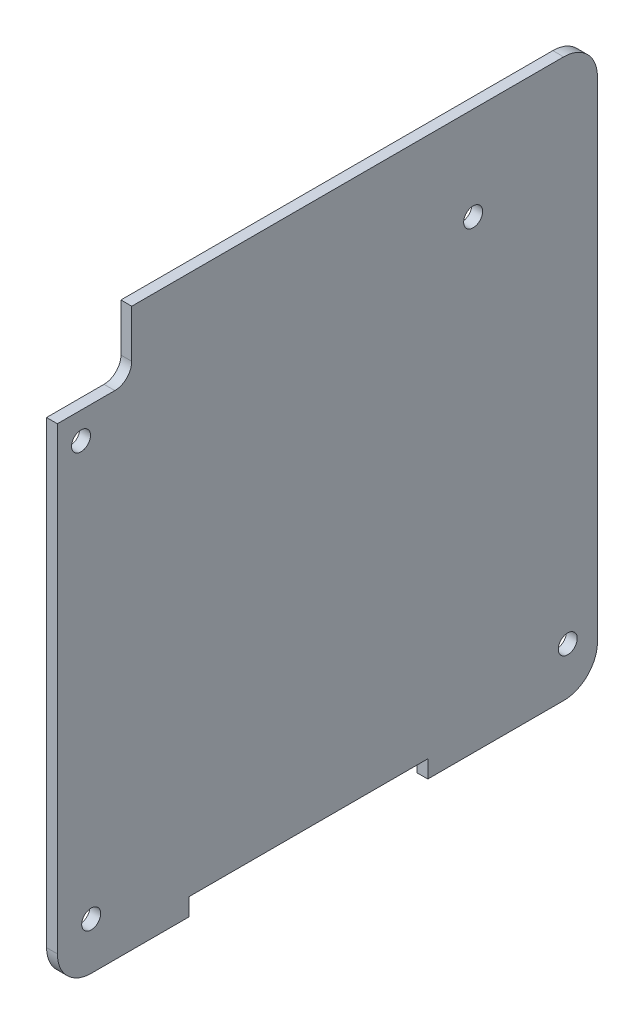
ISO-10303-21;
HEADER;
FILE_DESCRIPTION(('STEP AP214'),'2;1');
FILE_NAME('part.step','',(''),(''),'','','');
FILE_SCHEMA(('AUTOMOTIVE_DESIGN { 1 0 10303 214 1 1 1 1 }'));
ENDSEC;
DATA;
#1=APPLICATION_CONTEXT('core data for automotive mechanical design processes');
#2=APPLICATION_PROTOCOL_DEFINITION('international standard','automotive_design',2000,#1);
#3=PRODUCT_CONTEXT('',#1,'mechanical');
#4=PRODUCT('Part','Part','',(#3));
#5=PRODUCT_RELATED_PRODUCT_CATEGORY('part','',(#4));
#6=PRODUCT_DEFINITION_FORMATION('','',#4);
#7=PRODUCT_DEFINITION_CONTEXT('part definition',#1,'design');
#8=PRODUCT_DEFINITION('design','',#6,#7);
#9=PRODUCT_DEFINITION_SHAPE('','',#8);
#10=(LENGTH_UNIT() NAMED_UNIT(*) SI_UNIT(.MILLI.,.METRE.));
#11=(NAMED_UNIT(*) PLANE_ANGLE_UNIT() SI_UNIT($,.RADIAN.));
#12=(NAMED_UNIT(*) SI_UNIT($,.STERADIAN.) SOLID_ANGLE_UNIT());
#13=UNCERTAINTY_MEASURE_WITH_UNIT(LENGTH_MEASURE(1.E-05),#10,'distance_accuracy_value','');
#14=(GEOMETRIC_REPRESENTATION_CONTEXT(3) GLOBAL_UNCERTAINTY_ASSIGNED_CONTEXT((#13)) GLOBAL_UNIT_ASSIGNED_CONTEXT((#10,
#11,#12)) REPRESENTATION_CONTEXT('',''));
#15=CARTESIAN_POINT('',(0.,0.,0.));
#16=DIRECTION('',(0.,0.,1.));
#17=DIRECTION('',(1.,0.,0.));
#18=AXIS2_PLACEMENT_3D('',#15,#16,#17);
#19=CARTESIAN_POINT('',(0.8,33.7284132652433,31.7974349336434));
#20=DIRECTION('',(1.,0.,0.));
#21=DIRECTION('',(0.,0.,-1.));
#22=AXIS2_PLACEMENT_3D('',#19,#20,#21);
#23=PLANE('',#22);
#24=CARTESIAN_POINT('',(0.8,-34.7152301778722,35.2974349336434));
#25=DIRECTION('',(1.,0.,0.));
#26=DIRECTION('',(0.,0.,-1.));
#27=AXIS2_PLACEMENT_3D('',#24,#25,#26);
#28=CIRCLE('',#27,1.4);
#29=CARTESIAN_POINT('',(0.8,-34.7152301778722,33.8974349336434));
#30=VERTEX_POINT('',#29);
#31=EDGE_CURVE('E368',#30,#30,#28,.T.);
#32=ORIENTED_EDGE('',*,*,#31,.F.);
#33=EDGE_LOOP('',(#32));
#34=FACE_BOUND('',#33,.T.);
#35=CARTESIAN_POINT('',(0.8,27.2847698221278,36.7974349336434));
#36=DIRECTION('',(1.,0.,0.));
#37=DIRECTION('',(0.,0.,-1.));
#38=AXIS2_PLACEMENT_3D('',#35,#36,#37);
#39=CIRCLE('',#38,1.4);
#40=CARTESIAN_POINT('',(0.8,27.2847698221278,35.3974349336434));
#41=VERTEX_POINT('',#40);
#42=EDGE_CURVE('E186',#41,#41,#39,.T.);
#43=ORIENTED_EDGE('',*,*,#42,.F.);
#44=EDGE_LOOP('',(#43));
#45=FACE_BOUND('',#44,.T.);
#46=CARTESIAN_POINT('',(0.8,33.7284132652433,31.7974349336434));
#47=DIRECTION('',(-1.,0.,0.));
#48=DIRECTION('',(0.,0.,-1.));
#49=AXIS2_PLACEMENT_3D('',#46,#47,#48);
#50=CIRCLE('',#49,2.5);
#51=CARTESIAN_POINT('',(0.8,33.7284132652433,29.2974349336434));
#52=VERTEX_POINT('',#51);
#53=CARTESIAN_POINT('',(0.8,31.2284132652433,31.7974349336434));
#54=VERTEX_POINT('',#53);
#55=EDGE_CURVE('E222',#52,#54,#50,.T.);
#56=ORIENTED_EDGE('',*,*,#55,.T.);
#57=DIRECTION('',(0.,0.,1.));
#58=VECTOR('',#57,1.);
#59=CARTESIAN_POINT('',(0.8,31.2284132652433,40.2974349336434));
#60=LINE('',#59,#58);
#61=CARTESIAN_POINT('',(0.8,31.2284132652433,40.2974349336434));
#62=VERTEX_POINT('',#61);
#63=EDGE_CURVE('E122',#54,#62,#60,.T.);
#64=ORIENTED_EDGE('',*,*,#63,.T.);
#65=DIRECTION('',(0.,-1.,0.));
#66=VECTOR('',#65,1.);
#67=CARTESIAN_POINT('',(0.8,-36.688152999817,40.2974349336434));
#68=LINE('',#67,#66);
#69=CARTESIAN_POINT('',(0.8,-36.688152999817,40.2974349336434));
#70=VERTEX_POINT('',#69);
#71=EDGE_CURVE('E267',#62,#70,#68,.T.);
#72=ORIENTED_EDGE('',*,*,#71,.T.);
#73=CARTESIAN_POINT('',(0.8,-36.688152999817,35.2974349336434));
#74=DIRECTION('',(1.,0.,0.));
#75=DIRECTION('',(0.,0.,1.));
#76=AXIS2_PLACEMENT_3D('',#73,#74,#75);
#77=CIRCLE('',#76,5.);
#78=CARTESIAN_POINT('',(0.8,-41.688152999817,35.2974349336434));
#79=VERTEX_POINT('',#78);
#80=EDGE_CURVE('E287',#70,#79,#77,.T.);
#81=ORIENTED_EDGE('',*,*,#80,.T.);
#82=DIRECTION('',(0.,0.,-1.));
#83=VECTOR('',#82,1.);
#84=CARTESIAN_POINT('',(0.8,-41.688152999817,35.2974349336434));
#85=LINE('',#84,#83);
#86=CARTESIAN_POINT('',(0.8,-41.688152999817,20.8094349336434));
#87=VERTEX_POINT('',#86);
#88=EDGE_CURVE('E283',#79,#87,#85,.T.);
#89=ORIENTED_EDGE('',*,*,#88,.T.);
#90=DIRECTION('',(0.,1.,0.));
#91=VECTOR('',#90,1.);
#92=CARTESIAN_POINT('',(0.8,-41.688152999817,20.8094349336434));
#93=LINE('',#92,#91);
#94=CARTESIAN_POINT('',(0.8,-39.097052999817,20.8094349336434));
#95=VERTEX_POINT('',#94);
#96=EDGE_CURVE('E286',#87,#95,#93,.T.);
#97=ORIENTED_EDGE('',*,*,#96,.T.);
#98=DIRECTION('',(0.,0.,-1.));
#99=VECTOR('',#98,1.);
#100=CARTESIAN_POINT('',(0.8,-39.097052999817,20.8094349336434));
#101=LINE('',#100,#99);
#102=CARTESIAN_POINT('',(0.8,-39.097052999817,-14.4965650663566));
#103=VERTEX_POINT('',#102);
#104=EDGE_CURVE('E291',#95,#103,#101,.T.);
#105=ORIENTED_EDGE('',*,*,#104,.T.);
#106=DIRECTION('',(0.,-1.,0.));
#107=VECTOR('',#106,1.);
#108=CARTESIAN_POINT('',(0.8,-39.097052999817,-14.4965650663566));
#109=LINE('',#108,#107);
#110=CARTESIAN_POINT('',(0.8,-41.688152999817,-14.4965650663566));
#111=VERTEX_POINT('',#110);
#112=EDGE_CURVE('E298',#103,#111,#109,.T.);
#113=ORIENTED_EDGE('',*,*,#112,.T.);
#114=DIRECTION('',(0.,0.,-1.));
#115=VECTOR('',#114,1.);
#116=CARTESIAN_POINT('',(0.8,-41.688152999817,-14.4965650663566));
#117=LINE('',#116,#115);
#118=CARTESIAN_POINT('',(0.8,-41.688152999817,-34.592039339058));
#119=VERTEX_POINT('',#118);
#120=EDGE_CURVE('E301',#111,#119,#117,.T.);
#121=ORIENTED_EDGE('',*,*,#120,.T.);
#122=CARTESIAN_POINT('',(0.8,-36.688152999817,-34.592039339058));
#123=DIRECTION('',(1.,0.,0.));
#124=DIRECTION('',(0.,0.,-1.));
#125=AXIS2_PLACEMENT_3D('',#122,#123,#124);
#126=CIRCLE('',#125,5.);
#127=CARTESIAN_POINT('',(0.8,-36.688152999817,-39.592039339058));
#128=VERTEX_POINT('',#127);
#129=EDGE_CURVE('E304',#119,#128,#126,.T.);
#130=ORIENTED_EDGE('',*,*,#129,.T.);
#131=DIRECTION('',(0.,1.,0.));
#132=VECTOR('',#131,1.);
#133=CARTESIAN_POINT('',(0.8,-36.688152999817,-39.592039339058));
#134=LINE('',#133,#132);
#135=CARTESIAN_POINT('',(0.8,35.7847698221278,-39.592039339058));
#136=VERTEX_POINT('',#135);
#137=EDGE_CURVE('E159',#128,#136,#134,.T.);
#138=ORIENTED_EDGE('',*,*,#137,.T.);
#139=CARTESIAN_POINT('',(0.8,35.7847698221278,-34.592039339058));
#140=DIRECTION('',(1.,0.,0.));
#141=DIRECTION('',(0.,0.,1.));
#142=AXIS2_PLACEMENT_3D('',#139,#140,#141);
#143=CIRCLE('',#142,5.00000000000001);
#144=CARTESIAN_POINT('',(0.8,40.7847698221278,-34.592039339058));
#145=VERTEX_POINT('',#144);
#146=EDGE_CURVE('E153',#136,#145,#143,.T.);
#147=ORIENTED_EDGE('',*,*,#146,.T.);
#148=DIRECTION('',(0.,0.,1.));
#149=VECTOR('',#148,1.);
#150=CARTESIAN_POINT('',(0.8,40.7847698221278,29.2974349336434));
#151=LINE('',#150,#149);
#152=CARTESIAN_POINT('',(0.8,40.7847698221278,29.2974349336434));
#153=VERTEX_POINT('',#152);
#154=EDGE_CURVE('E157',#145,#153,#151,.T.);
#155=ORIENTED_EDGE('',*,*,#154,.T.);
#156=DIRECTION('',(0.,-1.,0.));
#157=VECTOR('',#156,1.);
#158=CARTESIAN_POINT('',(0.8,40.7847698221278,29.2974349336434));
#159=LINE('',#158,#157);
#160=EDGE_CURVE('E61',#153,#52,#159,.T.);
#161=ORIENTED_EDGE('',*,*,#160,.T.);
#162=EDGE_LOOP('',(#56,#64,#72,#81,#89,#97,#105,#113,#121,#130,#138,#147,#155,#161));
#163=FACE_BOUND('',#162,.T.);
#164=CARTESIAN_POINT('',(0.8,26.9847698221278,-21.2025650663566));
#165=DIRECTION('',(1.,0.,0.));
#166=DIRECTION('',(0.,0.,-1.));
#167=AXIS2_PLACEMENT_3D('',#164,#165,#166);
#168=CIRCLE('',#167,1.4);
#169=CARTESIAN_POINT('',(0.8,26.9847698221278,-22.6025650663566));
#170=VERTEX_POINT('',#169);
#171=EDGE_CURVE('E376',#170,#170,#168,.T.);
#172=ORIENTED_EDGE('',*,*,#171,.F.);
#173=EDGE_LOOP('',(#172));
#174=FACE_BOUND('',#173,.T.);
#175=CARTESIAN_POINT('',(0.8,-34.7152301778722,-35.2025650663566));
#176=DIRECTION('',(1.,0.,0.));
#177=DIRECTION('',(0.,0.,-1.));
#178=AXIS2_PLACEMENT_3D('',#175,#176,#177);
#179=CIRCLE('',#178,1.4);
#180=CARTESIAN_POINT('',(0.8,-34.7152301778722,-36.6025650663566));
#181=VERTEX_POINT('',#180);
#182=EDGE_CURVE('E357',#181,#181,#179,.T.);
#183=ORIENTED_EDGE('',*,*,#182,.F.);
#184=EDGE_LOOP('',(#183));
#185=FACE_BOUND('',#184,.T.);
#186=ADVANCED_FACE('F43',(#34,#45,#163,#174,#185),#23,.T.);
#187=CARTESIAN_POINT('',(-0.8,33.7284132652433,31.7974349336434));
#188=DIRECTION('',(1.,0.,0.));
#189=DIRECTION('',(0.,0.,-1.));
#190=AXIS2_PLACEMENT_3D('',#187,#188,#189);
#191=PLANE('',#190);
#192=CARTESIAN_POINT('',(-0.8,33.7284132652433,31.7974349336434));
#193=DIRECTION('',(-1.,0.,0.));
#194=DIRECTION('',(0.,0.,-1.));
#195=AXIS2_PLACEMENT_3D('',#192,#193,#194);
#196=CIRCLE('',#195,2.5);
#197=CARTESIAN_POINT('',(-0.8,33.7284132652433,29.2974349336434));
#198=VERTEX_POINT('',#197);
#199=CARTESIAN_POINT('',(-0.8,31.2284132652433,31.7974349336434));
#200=VERTEX_POINT('',#199);
#201=EDGE_CURVE('E181',#198,#200,#196,.T.);
#202=ORIENTED_EDGE('',*,*,#201,.F.);
#203=DIRECTION('',(0.,-1.,0.));
#204=VECTOR('',#203,1.);
#205=CARTESIAN_POINT('',(-0.8,40.7847698221278,29.2974349336434));
#206=LINE('',#205,#204);
#207=CARTESIAN_POINT('',(-0.8,40.7847698221278,29.2974349336434));
#208=VERTEX_POINT('',#207);
#209=EDGE_CURVE('E114',#208,#198,#206,.T.);
#210=ORIENTED_EDGE('',*,*,#209,.F.);
#211=DIRECTION('',(0.,0.,1.));
#212=VECTOR('',#211,1.);
#213=CARTESIAN_POINT('',(-0.8,40.7847698221278,29.2974349336434));
#214=LINE('',#213,#212);
#215=CARTESIAN_POINT('',(-0.8,40.7847698221278,-34.592039339058));
#216=VERTEX_POINT('',#215);
#217=EDGE_CURVE('E108',#216,#208,#214,.T.);
#218=ORIENTED_EDGE('',*,*,#217,.F.);
#219=CARTESIAN_POINT('',(-0.8,35.7847698221278,-34.592039339058));
#220=DIRECTION('',(1.,0.,0.));
#221=DIRECTION('',(0.,0.,1.));
#222=AXIS2_PLACEMENT_3D('',#219,#220,#221);
#223=CIRCLE('',#222,5.00000000000001);
#224=CARTESIAN_POINT('',(-0.8,35.7847698221278,-39.592039339058));
#225=VERTEX_POINT('',#224);
#226=EDGE_CURVE('E168',#225,#216,#223,.T.);
#227=ORIENTED_EDGE('',*,*,#226,.F.);
#228=DIRECTION('',(0.,1.,0.));
#229=VECTOR('',#228,1.);
#230=CARTESIAN_POINT('',(-0.8,-36.688152999817,-39.592039339058));
#231=LINE('',#230,#229);
#232=CARTESIAN_POINT('',(-0.8,-36.688152999817,-39.592039339058));
#233=VERTEX_POINT('',#232);
#234=EDGE_CURVE('E213',#233,#225,#231,.T.);
#235=ORIENTED_EDGE('',*,*,#234,.F.);
#236=CARTESIAN_POINT('',(-0.8,-36.688152999817,-34.592039339058));
#237=DIRECTION('',(1.,0.,0.));
#238=DIRECTION('',(0.,0.,-1.));
#239=AXIS2_PLACEMENT_3D('',#236,#237,#238);
#240=CIRCLE('',#239,5.);
#241=CARTESIAN_POINT('',(-0.8,-41.688152999817,-34.592039339058));
#242=VERTEX_POINT('',#241);
#243=EDGE_CURVE('E210',#242,#233,#240,.T.);
#244=ORIENTED_EDGE('',*,*,#243,.F.);
#245=DIRECTION('',(0.,0.,-1.));
#246=VECTOR('',#245,1.);
#247=CARTESIAN_POINT('',(-0.8,-41.688152999817,-14.4965650663566));
#248=LINE('',#247,#246);
#249=CARTESIAN_POINT('',(-0.8,-41.688152999817,-14.4965650663566));
#250=VERTEX_POINT('',#249);
#251=EDGE_CURVE('E207',#250,#242,#248,.T.);
#252=ORIENTED_EDGE('',*,*,#251,.F.);
#253=DIRECTION('',(0.,-1.,0.));
#254=VECTOR('',#253,1.);
#255=CARTESIAN_POINT('',(-0.8,-39.097052999817,-14.4965650663566));
#256=LINE('',#255,#254);
#257=CARTESIAN_POINT('',(-0.8,-39.097052999817,-14.4965650663566));
#258=VERTEX_POINT('',#257);
#259=EDGE_CURVE('E204',#258,#250,#256,.T.);
#260=ORIENTED_EDGE('',*,*,#259,.F.);
#261=DIRECTION('',(0.,0.,-1.));
#262=VECTOR('',#261,1.);
#263=CARTESIAN_POINT('',(-0.8,-39.097052999817,20.8094349336434));
#264=LINE('',#263,#262);
#265=CARTESIAN_POINT('',(-0.8,-39.097052999817,20.8094349336434));
#266=VERTEX_POINT('',#265);
#267=EDGE_CURVE('E201',#266,#258,#264,.T.);
#268=ORIENTED_EDGE('',*,*,#267,.F.);
#269=DIRECTION('',(0.,1.,0.));
#270=VECTOR('',#269,1.);
#271=CARTESIAN_POINT('',(-0.8,-41.688152999817,20.8094349336434));
#272=LINE('',#271,#270);
#273=CARTESIAN_POINT('',(-0.8,-41.688152999817,20.8094349336434));
#274=VERTEX_POINT('',#273);
#275=EDGE_CURVE('E198',#274,#266,#272,.T.);
#276=ORIENTED_EDGE('',*,*,#275,.F.);
#277=DIRECTION('',(0.,0.,-1.));
#278=VECTOR('',#277,1.);
#279=CARTESIAN_POINT('',(-0.8,-41.688152999817,35.2974349336434));
#280=LINE('',#279,#278);
#281=CARTESIAN_POINT('',(-0.8,-41.688152999817,35.2974349336434));
#282=VERTEX_POINT('',#281);
#283=EDGE_CURVE('E195',#282,#274,#280,.T.);
#284=ORIENTED_EDGE('',*,*,#283,.F.);
#285=CARTESIAN_POINT('',(-0.8,-36.688152999817,35.2974349336434));
#286=DIRECTION('',(1.,0.,0.));
#287=DIRECTION('',(0.,0.,1.));
#288=AXIS2_PLACEMENT_3D('',#285,#286,#287);
#289=CIRCLE('',#288,5.);
#290=CARTESIAN_POINT('',(-0.8,-36.688152999817,40.2974349336434));
#291=VERTEX_POINT('',#290);
#292=EDGE_CURVE('E192',#291,#282,#289,.T.);
#293=ORIENTED_EDGE('',*,*,#292,.F.);
#294=DIRECTION('',(0.,-1.,0.));
#295=VECTOR('',#294,1.);
#296=CARTESIAN_POINT('',(-0.8,-36.688152999817,40.2974349336434));
#297=LINE('',#296,#295);
#298=CARTESIAN_POINT('',(-0.8,31.2284132652433,40.2974349336434));
#299=VERTEX_POINT('',#298);
#300=EDGE_CURVE('E189',#299,#291,#297,.T.);
#301=ORIENTED_EDGE('',*,*,#300,.F.);
#302=DIRECTION('',(0.,0.,1.));
#303=VECTOR('',#302,1.);
#304=CARTESIAN_POINT('',(-0.8,31.2284132652433,40.2974349336434));
#305=LINE('',#304,#303);
#306=EDGE_CURVE('E185',#200,#299,#305,.T.);
#307=ORIENTED_EDGE('',*,*,#306,.F.);
#308=EDGE_LOOP('',(#202,#210,#218,#227,#235,#244,#252,#260,#268,#276,#284,#293,#301,#307));
#309=FACE_BOUND('',#308,.T.);
#310=CARTESIAN_POINT('',(-0.8,27.2847698221278,36.7974349336434));
#311=DIRECTION('',(1.,0.,0.));
#312=DIRECTION('',(0.,0.,-1.));
#313=AXIS2_PLACEMENT_3D('',#310,#311,#312);
#314=CIRCLE('',#313,1.4);
#315=CARTESIAN_POINT('',(-0.8,27.2847698221278,35.3974349336434));
#316=VERTEX_POINT('',#315);
#317=EDGE_CURVE('E380',#316,#316,#314,.T.);
#318=ORIENTED_EDGE('',*,*,#317,.T.);
#319=EDGE_LOOP('',(#318));
#320=FACE_BOUND('',#319,.T.);
#321=CARTESIAN_POINT('',(-0.8,26.9847698221278,-21.2025650663566));
#322=DIRECTION('',(1.,0.,0.));
#323=DIRECTION('',(0.,0.,-1.));
#324=AXIS2_PLACEMENT_3D('',#321,#322,#323);
#325=CIRCLE('',#324,1.4);
#326=CARTESIAN_POINT('',(-0.8,26.9847698221278,-22.6025650663566));
#327=VERTEX_POINT('',#326);
#328=EDGE_CURVE('E372',#327,#327,#325,.T.);
#329=ORIENTED_EDGE('',*,*,#328,.T.);
#330=EDGE_LOOP('',(#329));
#331=FACE_BOUND('',#330,.T.);
#332=CARTESIAN_POINT('',(-0.8,-34.7152301778722,35.2974349336434));
#333=DIRECTION('',(1.,0.,0.));
#334=DIRECTION('',(0.,0.,-1.));
#335=AXIS2_PLACEMENT_3D('',#332,#333,#334);
#336=CIRCLE('',#335,1.4);
#337=CARTESIAN_POINT('',(-0.8,-34.7152301778722,33.8974349336434));
#338=VERTEX_POINT('',#337);
#339=EDGE_CURVE('E365',#338,#338,#336,.T.);
#340=ORIENTED_EDGE('',*,*,#339,.T.);
#341=EDGE_LOOP('',(#340));
#342=FACE_BOUND('',#341,.T.);
#343=CARTESIAN_POINT('',(-0.8,-34.7152301778722,-35.2025650663566));
#344=DIRECTION('',(1.,0.,0.));
#345=DIRECTION('',(0.,0.,-1.));
#346=AXIS2_PLACEMENT_3D('',#343,#344,#345);
#347=CIRCLE('',#346,1.4);
#348=CARTESIAN_POINT('',(-0.8,-34.7152301778722,-36.6025650663566));
#349=VERTEX_POINT('',#348);
#350=EDGE_CURVE('E360',#349,#349,#347,.T.);
#351=ORIENTED_EDGE('',*,*,#350,.T.);
#352=EDGE_LOOP('',(#351));
#353=FACE_BOUND('',#352,.T.);
#354=ADVANCED_FACE('F271',(#309,#320,#331,#342,#353),#191,.F.);
#355=CARTESIAN_POINT('',(0.8,33.7284132652433,31.7974349336434));
#356=DIRECTION('',(-1.,0.,0.));
#357=DIRECTION('',(0.,0.,1.));
#358=AXIS2_PLACEMENT_3D('',#355,#356,#357);
#359=CYLINDRICAL_SURFACE('',#358,2.5);
#360=ORIENTED_EDGE('',*,*,#201,.T.);
#361=DIRECTION('',(-1.,0.,0.));
#362=VECTOR('',#361,1.);
#363=CARTESIAN_POINT('',(0.8,31.2284132652433,31.7974349336434));
#364=LINE('',#363,#362);
#365=EDGE_CURVE('E11',#54,#200,#364,.T.);
#366=ORIENTED_EDGE('',*,*,#365,.F.);
#367=ORIENTED_EDGE('',*,*,#55,.F.);
#368=DIRECTION('',(-1.,0.,0.));
#369=VECTOR('',#368,1.);
#370=CARTESIAN_POINT('',(0.8,33.7284132652433,29.2974349336434));
#371=LINE('',#370,#369);
#372=EDGE_CURVE('E177',#52,#198,#371,.T.);
#373=ORIENTED_EDGE('',*,*,#372,.T.);
#374=EDGE_LOOP('',(#360,#366,#367,#373));
#375=FACE_BOUND('',#374,.T.);
#376=ADVANCED_FACE('F45',(#375),#359,.F.);
#377=CARTESIAN_POINT('',(0.8,31.2284132652433,40.2974349336434));
#378=DIRECTION('',(0.,-1.,0.));
#379=DIRECTION('',(0.,0.,-1.));
#380=AXIS2_PLACEMENT_3D('',#377,#378,#379);
#381=PLANE('',#380);
#382=ORIENTED_EDGE('',*,*,#306,.T.);
#383=DIRECTION('',(-1.,0.,0.));
#384=VECTOR('',#383,1.);
#385=CARTESIAN_POINT('',(0.8,31.2284132652433,40.2974349336434));
#386=LINE('',#385,#384);
#387=EDGE_CURVE('E53',#62,#299,#386,.T.);
#388=ORIENTED_EDGE('',*,*,#387,.F.);
#389=ORIENTED_EDGE('',*,*,#63,.F.);
#390=ORIENTED_EDGE('',*,*,#365,.T.);
#391=EDGE_LOOP('',(#382,#388,#389,#390));
#392=FACE_BOUND('',#391,.T.);
#393=ADVANCED_FACE('F528',(#392),#381,.F.);
#394=CARTESIAN_POINT('',(0.8,-36.688152999817,40.2974349336434));
#395=DIRECTION('',(0.,0.,-1.));
#396=DIRECTION('',(-1.,0.,0.));
#397=AXIS2_PLACEMENT_3D('',#394,#395,#396);
#398=PLANE('',#397);
#399=ORIENTED_EDGE('',*,*,#300,.T.);
#400=DIRECTION('',(-1.,0.,0.));
#401=VECTOR('',#400,1.);
#402=CARTESIAN_POINT('',(0.8,-36.688152999817,40.2974349336434));
#403=LINE('',#402,#401);
#404=EDGE_CURVE('E257',#70,#291,#403,.T.);
#405=ORIENTED_EDGE('',*,*,#404,.F.);
#406=ORIENTED_EDGE('',*,*,#71,.F.);
#407=ORIENTED_EDGE('',*,*,#387,.T.);
#408=EDGE_LOOP('',(#399,#405,#406,#407));
#409=FACE_BOUND('',#408,.T.);
#410=ADVANCED_FACE('F265',(#409),#398,.F.);
#411=CARTESIAN_POINT('',(0.8,-36.688152999817,35.2974349336434));
#412=DIRECTION('',(-1.,0.,0.));
#413=DIRECTION('',(0.,0.,1.));
#414=AXIS2_PLACEMENT_3D('',#411,#412,#413);
#415=CYLINDRICAL_SURFACE('',#414,5.);
#416=ORIENTED_EDGE('',*,*,#292,.T.);
#417=DIRECTION('',(-1.,0.,0.));
#418=VECTOR('',#417,1.);
#419=CARTESIAN_POINT('',(0.8,-41.688152999817,35.2974349336434));
#420=LINE('',#419,#418);
#421=EDGE_CURVE('E253',#79,#282,#420,.T.);
#422=ORIENTED_EDGE('',*,*,#421,.F.);
#423=ORIENTED_EDGE('',*,*,#80,.F.);
#424=ORIENTED_EDGE('',*,*,#404,.T.);
#425=EDGE_LOOP('',(#416,#422,#423,#424));
#426=FACE_BOUND('',#425,.T.);
#427=ADVANCED_FACE('F277',(#426),#415,.T.);
#428=CARTESIAN_POINT('',(0.8,-41.688152999817,35.2974349336434));
#429=DIRECTION('',(0.,1.,0.));
#430=DIRECTION('',(0.,0.,1.));
#431=AXIS2_PLACEMENT_3D('',#428,#429,#430);
#432=PLANE('',#431);
#433=ORIENTED_EDGE('',*,*,#283,.T.);
#434=DIRECTION('',(-1.,0.,0.));
#435=VECTOR('',#434,1.);
#436=CARTESIAN_POINT('',(0.8,-41.688152999817,20.8094349336434));
#437=LINE('',#436,#435);
#438=EDGE_CURVE('E249',#87,#274,#437,.T.);
#439=ORIENTED_EDGE('',*,*,#438,.F.);
#440=ORIENTED_EDGE('',*,*,#88,.F.);
#441=ORIENTED_EDGE('',*,*,#421,.T.);
#442=EDGE_LOOP('',(#433,#439,#440,#441));
#443=FACE_BOUND('',#442,.T.);
#444=ADVANCED_FACE('F281',(#443),#432,.F.);
#445=CARTESIAN_POINT('',(0.8,-41.688152999817,20.8094349336434));
#446=DIRECTION('',(0.,0.,1.));
#447=DIRECTION('',(1.,0.,0.));
#448=AXIS2_PLACEMENT_3D('',#445,#446,#447);
#449=PLANE('',#448);
#450=ORIENTED_EDGE('',*,*,#275,.T.);
#451=DIRECTION('',(-1.,0.,0.));
#452=VECTOR('',#451,1.);
#453=CARTESIAN_POINT('',(0.8,-39.097052999817,20.8094349336434));
#454=LINE('',#453,#452);
#455=EDGE_CURVE('E245',#95,#266,#454,.T.);
#456=ORIENTED_EDGE('',*,*,#455,.F.);
#457=ORIENTED_EDGE('',*,*,#96,.F.);
#458=ORIENTED_EDGE('',*,*,#438,.T.);
#459=EDGE_LOOP('',(#450,#456,#457,#458));
#460=FACE_BOUND('',#459,.T.);
#461=ADVANCED_FACE('F489',(#460),#449,.F.);
#462=CARTESIAN_POINT('',(0.8,-39.097052999817,20.8094349336434));
#463=DIRECTION('',(0.,1.,0.));
#464=DIRECTION('',(0.,0.,1.));
#465=AXIS2_PLACEMENT_3D('',#462,#463,#464);
#466=PLANE('',#465);
#467=ORIENTED_EDGE('',*,*,#267,.T.);
#468=DIRECTION('',(-1.,0.,0.));
#469=VECTOR('',#468,1.);
#470=CARTESIAN_POINT('',(0.8,-39.097052999817,-14.4965650663566));
#471=LINE('',#470,#469);
#472=EDGE_CURVE('E241',#103,#258,#471,.T.);
#473=ORIENTED_EDGE('',*,*,#472,.F.);
#474=ORIENTED_EDGE('',*,*,#104,.F.);
#475=ORIENTED_EDGE('',*,*,#455,.T.);
#476=EDGE_LOOP('',(#467,#473,#474,#475));
#477=FACE_BOUND('',#476,.T.);
#478=ADVANCED_FACE('F478',(#477),#466,.F.);
#479=CARTESIAN_POINT('',(0.8,-39.097052999817,-14.4965650663566));
#480=DIRECTION('',(0.,0.,-1.));
#481=DIRECTION('',(-1.,0.,0.));
#482=AXIS2_PLACEMENT_3D('',#479,#480,#481);
#483=PLANE('',#482);
#484=ORIENTED_EDGE('',*,*,#259,.T.);
#485=DIRECTION('',(-1.,0.,0.));
#486=VECTOR('',#485,1.);
#487=CARTESIAN_POINT('',(0.8,-41.688152999817,-14.4965650663566));
#488=LINE('',#487,#486);
#489=EDGE_CURVE('E237',#111,#250,#488,.T.);
#490=ORIENTED_EDGE('',*,*,#489,.F.);
#491=ORIENTED_EDGE('',*,*,#112,.F.);
#492=ORIENTED_EDGE('',*,*,#472,.T.);
#493=EDGE_LOOP('',(#484,#490,#491,#492));
#494=FACE_BOUND('',#493,.T.);
#495=ADVANCED_FACE('F467',(#494),#483,.F.);
#496=CARTESIAN_POINT('',(0.8,-41.688152999817,-14.4965650663566));
#497=DIRECTION('',(0.,1.,0.));
#498=DIRECTION('',(0.,0.,1.));
#499=AXIS2_PLACEMENT_3D('',#496,#497,#498);
#500=PLANE('',#499);
#501=ORIENTED_EDGE('',*,*,#251,.T.);
#502=DIRECTION('',(-1.,0.,0.));
#503=VECTOR('',#502,1.);
#504=CARTESIAN_POINT('',(0.8,-41.688152999817,-34.592039339058));
#505=LINE('',#504,#503);
#506=EDGE_CURVE('E233',#119,#242,#505,.T.);
#507=ORIENTED_EDGE('',*,*,#506,.F.);
#508=ORIENTED_EDGE('',*,*,#120,.F.);
#509=ORIENTED_EDGE('',*,*,#489,.T.);
#510=EDGE_LOOP('',(#501,#507,#508,#509));
#511=FACE_BOUND('',#510,.T.);
#512=ADVANCED_FACE('F457',(#511),#500,.F.);
#513=CARTESIAN_POINT('',(0.8,-36.688152999817,-34.592039339058));
#514=DIRECTION('',(-1.,0.,0.));
#515=DIRECTION('',(0.,0.,1.));
#516=AXIS2_PLACEMENT_3D('',#513,#514,#515);
#517=CYLINDRICAL_SURFACE('',#516,5.);
#518=ORIENTED_EDGE('',*,*,#243,.T.);
#519=DIRECTION('',(-1.,0.,0.));
#520=VECTOR('',#519,1.);
#521=CARTESIAN_POINT('',(0.8,-36.688152999817,-39.592039339058));
#522=LINE('',#521,#520);
#523=EDGE_CURVE('E229',#128,#233,#522,.T.);
#524=ORIENTED_EDGE('',*,*,#523,.F.);
#525=ORIENTED_EDGE('',*,*,#129,.F.);
#526=ORIENTED_EDGE('',*,*,#506,.T.);
#527=EDGE_LOOP('',(#518,#524,#525,#526));
#528=FACE_BOUND('',#527,.T.);
#529=ADVANCED_FACE('F312',(#528),#517,.T.);
#530=CARTESIAN_POINT('',(0.8,-36.688152999817,-39.592039339058));
#531=DIRECTION('',(0.,0.,1.));
#532=DIRECTION('',(1.,0.,0.));
#533=AXIS2_PLACEMENT_3D('',#530,#531,#532);
#534=PLANE('',#533);
#535=ORIENTED_EDGE('',*,*,#234,.T.);
#536=DIRECTION('',(-1.,0.,0.));
#537=VECTOR('',#536,1.);
#538=CARTESIAN_POINT('',(0.8,35.7847698221278,-39.592039339058));
#539=LINE('',#538,#537);
#540=EDGE_CURVE('E170',#136,#225,#539,.T.);
#541=ORIENTED_EDGE('',*,*,#540,.F.);
#542=ORIENTED_EDGE('',*,*,#137,.F.);
#543=ORIENTED_EDGE('',*,*,#523,.T.);
#544=EDGE_LOOP('',(#535,#541,#542,#543));
#545=FACE_BOUND('',#544,.T.);
#546=ADVANCED_FACE('F316',(#545),#534,.F.);
#547=CARTESIAN_POINT('',(0.8,35.7847698221278,-34.592039339058));
#548=DIRECTION('',(-1.,0.,0.));
#549=DIRECTION('',(0.,0.,1.));
#550=AXIS2_PLACEMENT_3D('',#547,#548,#549);
#551=CYLINDRICAL_SURFACE('',#550,5.00000000000001);
#552=ORIENTED_EDGE('',*,*,#226,.T.);
#553=DIRECTION('',(-1.,0.,0.));
#554=VECTOR('',#553,1.);
#555=CARTESIAN_POINT('',(0.8,40.7847698221278,-34.592039339058));
#556=LINE('',#555,#554);
#557=EDGE_CURVE('E165',#145,#216,#556,.T.);
#558=ORIENTED_EDGE('',*,*,#557,.F.);
#559=ORIENTED_EDGE('',*,*,#146,.F.);
#560=ORIENTED_EDGE('',*,*,#540,.T.);
#561=EDGE_LOOP('',(#552,#558,#559,#560));
#562=FACE_BOUND('',#561,.T.);
#563=ADVANCED_FACE('F166',(#562),#551,.T.);
#564=CARTESIAN_POINT('',(0.8,40.7847698221278,29.2974349336434));
#565=DIRECTION('',(0.,-1.,0.));
#566=DIRECTION('',(0.,0.,-1.));
#567=AXIS2_PLACEMENT_3D('',#564,#565,#566);
#568=PLANE('',#567);
#569=ORIENTED_EDGE('',*,*,#217,.T.);
#570=DIRECTION('',(-1.,0.,0.));
#571=VECTOR('',#570,1.);
#572=CARTESIAN_POINT('',(0.8,40.7847698221278,29.2974349336434));
#573=LINE('',#572,#571);
#574=EDGE_CURVE('E171',#153,#208,#573,.T.);
#575=ORIENTED_EDGE('',*,*,#574,.F.);
#576=ORIENTED_EDGE('',*,*,#154,.F.);
#577=ORIENTED_EDGE('',*,*,#557,.T.);
#578=EDGE_LOOP('',(#569,#575,#576,#577));
#579=FACE_BOUND('',#578,.T.);
#580=ADVANCED_FACE('F173',(#579),#568,.F.);
#581=CARTESIAN_POINT('',(0.8,40.7847698221278,29.2974349336434));
#582=DIRECTION('',(0.,0.,-1.));
#583=DIRECTION('',(0.,1.,0.));
#584=AXIS2_PLACEMENT_3D('',#581,#582,#583);
#585=PLANE('',#584);
#586=ORIENTED_EDGE('',*,*,#209,.T.);
#587=ORIENTED_EDGE('',*,*,#372,.F.);
#588=ORIENTED_EDGE('',*,*,#160,.F.);
#589=ORIENTED_EDGE('',*,*,#574,.T.);
#590=EDGE_LOOP('',(#586,#587,#588,#589));
#591=FACE_BOUND('',#590,.T.);
#592=ADVANCED_FACE('F320',(#591),#585,.F.);
#593=CARTESIAN_POINT('',(0.8,27.2847698221278,36.7974349336434));
#594=DIRECTION('',(-1.,0.,0.));
#595=DIRECTION('',(0.,0.,1.));
#596=AXIS2_PLACEMENT_3D('',#593,#594,#595);
#597=CYLINDRICAL_SURFACE('',#596,1.4);
#598=ORIENTED_EDGE('',*,*,#42,.T.);
#599=EDGE_LOOP('',(#598));
#600=FACE_BOUND('',#599,.T.);
#601=ORIENTED_EDGE('',*,*,#317,.F.);
#602=EDGE_LOOP('',(#601));
#603=FACE_BOUND('',#602,.T.);
#604=ADVANCED_FACE('F322',(#600,#603),#597,.F.);
#605=CARTESIAN_POINT('',(0.8,26.9847698221278,-21.2025650663566));
#606=DIRECTION('',(-1.,0.,0.));
#607=DIRECTION('',(0.,0.,1.));
#608=AXIS2_PLACEMENT_3D('',#605,#606,#607);
#609=CYLINDRICAL_SURFACE('',#608,1.4);
#610=ORIENTED_EDGE('',*,*,#171,.T.);
#611=EDGE_LOOP('',(#610));
#612=FACE_BOUND('',#611,.T.);
#613=ORIENTED_EDGE('',*,*,#328,.F.);
#614=EDGE_LOOP('',(#613));
#615=FACE_BOUND('',#614,.T.);
#616=ADVANCED_FACE('F328',(#612,#615),#609,.F.);
#617=CARTESIAN_POINT('',(0.8,-34.7152301778722,35.2974349336434));
#618=DIRECTION('',(-1.,0.,0.));
#619=DIRECTION('',(0.,0.,1.));
#620=AXIS2_PLACEMENT_3D('',#617,#618,#619);
#621=CYLINDRICAL_SURFACE('',#620,1.4);
#622=ORIENTED_EDGE('',*,*,#31,.T.);
#623=EDGE_LOOP('',(#622));
#624=FACE_BOUND('',#623,.T.);
#625=ORIENTED_EDGE('',*,*,#339,.F.);
#626=EDGE_LOOP('',(#625));
#627=FACE_BOUND('',#626,.T.);
#628=ADVANCED_FACE('F344',(#624,#627),#621,.F.);
#629=CARTESIAN_POINT('',(0.8,-34.7152301778722,-35.2025650663566));
#630=DIRECTION('',(-1.,0.,0.));
#631=DIRECTION('',(0.,0.,1.));
#632=AXIS2_PLACEMENT_3D('',#629,#630,#631);
#633=CYLINDRICAL_SURFACE('',#632,1.4);
#634=ORIENTED_EDGE('',*,*,#182,.T.);
#635=EDGE_LOOP('',(#634));
#636=FACE_BOUND('',#635,.T.);
#637=ORIENTED_EDGE('',*,*,#350,.F.);
#638=EDGE_LOOP('',(#637));
#639=FACE_BOUND('',#638,.T.);
#640=ADVANCED_FACE('F348',(#636,#639),#633,.F.);
#641=CLOSED_SHELL('',(#186,#354,#376,#393,#410,#427,#444,#461,#478,#495,#512,#529,#546,#563,
#580,#592,#604,#616,#628,#640));
#642=MANIFOLD_SOLID_BREP('B2',#641);
#643=ADVANCED_BREP_SHAPE_REPRESENTATION('',(#18,#642),#14);
#644=SHAPE_DEFINITION_REPRESENTATION(#9,#643);
ENDSEC;
END-ISO-10303-21;
